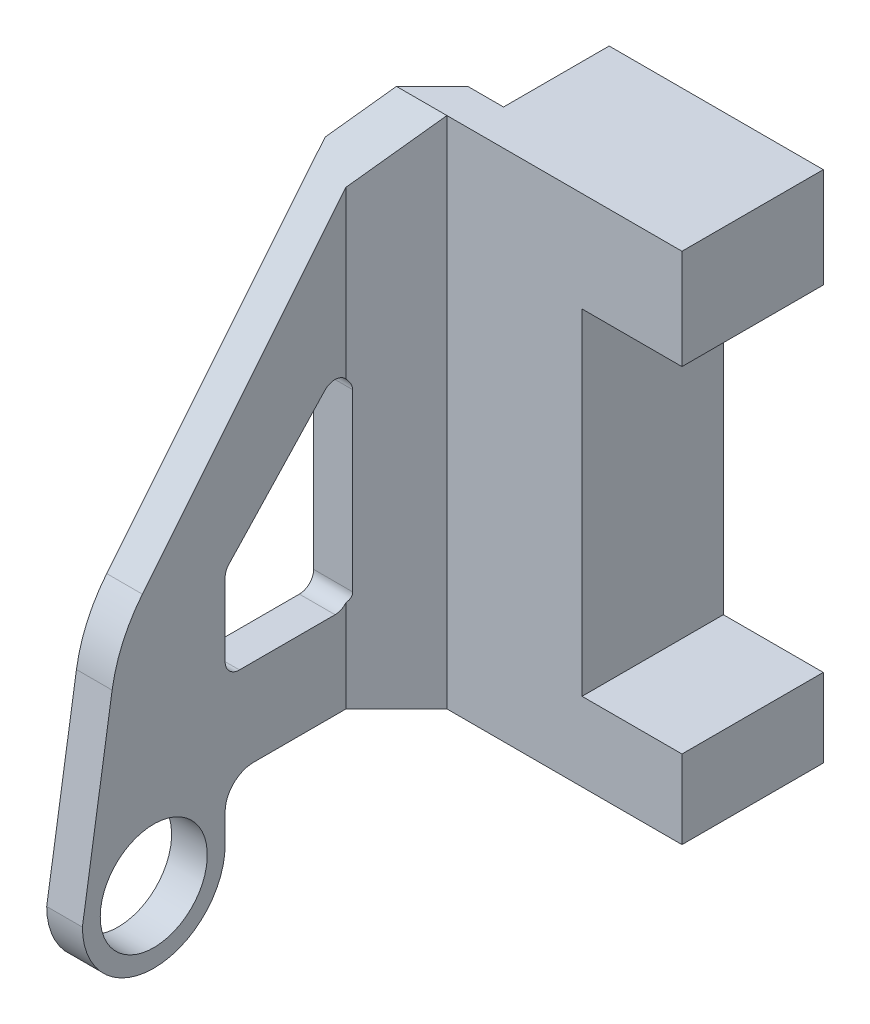
ISO-10303-21;
HEADER;
FILE_DESCRIPTION(('STEP AP214'),'2;1');
FILE_NAME('part.step','',(''),(''),'','','');
FILE_SCHEMA(('AUTOMOTIVE_DESIGN { 1 0 10303 214 1 1 1 1 }'));
ENDSEC;
DATA;
#1=APPLICATION_CONTEXT('core data for automotive mechanical design processes');
#2=APPLICATION_PROTOCOL_DEFINITION('international standard','automotive_design',2000,#1);
#3=PRODUCT_CONTEXT('',#1,'mechanical');
#4=PRODUCT('Part','Part','',(#3));
#5=PRODUCT_RELATED_PRODUCT_CATEGORY('part','',(#4));
#6=PRODUCT_DEFINITION_FORMATION('','',#4);
#7=PRODUCT_DEFINITION_CONTEXT('part definition',#1,'design');
#8=PRODUCT_DEFINITION('design','',#6,#7);
#9=PRODUCT_DEFINITION_SHAPE('','',#8);
#10=(LENGTH_UNIT() NAMED_UNIT(*) SI_UNIT(.MILLI.,.METRE.));
#11=(NAMED_UNIT(*) PLANE_ANGLE_UNIT() SI_UNIT($,.RADIAN.));
#12=(NAMED_UNIT(*) SI_UNIT($,.STERADIAN.) SOLID_ANGLE_UNIT());
#13=UNCERTAINTY_MEASURE_WITH_UNIT(LENGTH_MEASURE(1.E-05),#10,'distance_accuracy_value','');
#14=(GEOMETRIC_REPRESENTATION_CONTEXT(3) GLOBAL_UNCERTAINTY_ASSIGNED_CONTEXT((#13)) GLOBAL_UNIT_ASSIGNED_CONTEXT((#10,
#11,#12)) REPRESENTATION_CONTEXT('',''));
#15=CARTESIAN_POINT('',(0.,0.,0.));
#16=DIRECTION('',(0.,0.,1.));
#17=DIRECTION('',(1.,0.,0.));
#18=AXIS2_PLACEMENT_3D('',#15,#16,#17);
#19=CARTESIAN_POINT('',(-22.5,-4.,26.9));
#20=DIRECTION('',(-1.,0.,0.));
#21=DIRECTION('',(0.,0.,1.));
#22=AXIS2_PLACEMENT_3D('',#19,#20,#21);
#23=PLANE('',#22);
#24=CARTESIAN_POINT('',(-22.5,-4.,26.9));
#25=DIRECTION('',(-1.,0.,0.));
#26=DIRECTION('',(0.,0.,1.));
#27=AXIS2_PLACEMENT_3D('',#24,#25,#26);
#28=CIRCLE('',#27,3.75);
#29=CARTESIAN_POINT('',(-22.5,-4.,30.65));
#30=VERTEX_POINT('',#29);
#31=EDGE_CURVE('E776',#30,#30,#28,.T.);
#32=ORIENTED_EDGE('',*,*,#31,.F.);
#33=EDGE_LOOP('',(#32));
#34=FACE_BOUND('',#33,.T.);
#35=DIRECTION('',(0.,0.988012033751101,-0.15437688027361));
#36=VECTOR('',#35,1.);
#37=CARTESIAN_POINT('',(-22.5,-4.,31.9));
#38=LINE('',#37,#36);
#39=CARTESIAN_POINT('',(-22.5,-4.,31.9));
#40=VERTEX_POINT('',#39);
#41=CARTESIAN_POINT('',(-22.5,9.33291795760597,29.8167315691241));
#42=VERTEX_POINT('',#41);
#43=EDGE_CURVE('E312',#40,#42,#38,.T.);
#44=ORIENTED_EDGE('',*,*,#43,.T.);
#45=CARTESIAN_POINT('',(-22.5,7.78914915486987,19.9366112316131));
#46=DIRECTION('',(-1.,0.,0.));
#47=DIRECTION('',(0.,0.,1.));
#48=AXIS2_PLACEMENT_3D('',#45,#46,#47);
#49=CIRCLE('',#48,10.);
#50=CARTESIAN_POINT('',(-22.5,14.0950754058145,27.6977512327757));
#51=VERTEX_POINT('',#50);
#52=EDGE_CURVE('E367',#42,#51,#49,.T.);
#53=ORIENTED_EDGE('',*,*,#52,.T.);
#54=DIRECTION('',(0.,0.776114000116266,-0.630592625094466));
#55=VECTOR('',#54,1.);
#56=CARTESIAN_POINT('',(-22.5,12.,29.4));
#57=LINE('',#56,#55);
#58=CARTESIAN_POINT('',(-22.5,32.923076923077,12.4));
#59=VERTEX_POINT('',#58);
#60=EDGE_CURVE('E315',#51,#59,#57,.T.);
#61=ORIENTED_EDGE('',*,*,#60,.T.);
#62=DIRECTION('',(0.,1.,0.));
#63=VECTOR('',#62,1.);
#64=CARTESIAN_POINT('',(-22.5,-4.,12.4));
#65=LINE('',#64,#63);
#66=CARTESIAN_POINT('',(-22.5,0.,12.4));
#67=VERTEX_POINT('',#66);
#68=EDGE_CURVE('E299',#67,#59,#65,.T.);
#69=ORIENTED_EDGE('',*,*,#68,.F.);
#70=DIRECTION('',(0.,0.,1.));
#71=VECTOR('',#70,1.);
#72=CARTESIAN_POINT('',(-22.5,0.,7.4));
#73=LINE('',#72,#71);
#74=CARTESIAN_POINT('',(-22.5,0.,19.9));
#75=VERTEX_POINT('',#74);
#76=EDGE_CURVE('E306',#67,#75,#73,.T.);
#77=ORIENTED_EDGE('',*,*,#76,.T.);
#78=CARTESIAN_POINT('',(-22.5,-2.,19.9));
#79=DIRECTION('',(-1.,0.,0.));
#80=DIRECTION('',(0.,0.,1.));
#81=AXIS2_PLACEMENT_3D('',#78,#79,#80);
#82=CIRCLE('',#81,2.);
#83=CARTESIAN_POINT('',(-22.5,-2.,21.9));
#84=VERTEX_POINT('',#83);
#85=EDGE_CURVE('E11',#75,#84,#82,.F.);
#86=ORIENTED_EDGE('',*,*,#85,.T.);
#87=DIRECTION('',(0.,-1.,0.));
#88=VECTOR('',#87,1.);
#89=CARTESIAN_POINT('',(-22.5,0.,21.9));
#90=LINE('',#89,#88);
#91=CARTESIAN_POINT('',(-22.5,-4.,21.9));
#92=VERTEX_POINT('',#91);
#93=EDGE_CURVE('E308',#84,#92,#90,.T.);
#94=ORIENTED_EDGE('',*,*,#93,.T.);
#95=CARTESIAN_POINT('',(-22.5,-4.,26.9));
#96=DIRECTION('',(-1.,0.,0.));
#97=DIRECTION('',(0.,0.,1.));
#98=AXIS2_PLACEMENT_3D('',#95,#96,#97);
#99=CIRCLE('',#98,5.);
#100=EDGE_CURVE('E310',#92,#40,#99,.T.);
#101=ORIENTED_EDGE('',*,*,#100,.T.);
#102=EDGE_LOOP('',(#44,#53,#61,#69,#77,#86,#94,#101));
#103=FACE_BOUND('',#102,.T.);
#104=CARTESIAN_POINT('',(-22.5,19.3672423947041,14.2));
#105=DIRECTION('',(-1.,0.,0.));
#106=DIRECTION('',(0.,0.,1.));
#107=AXIS2_PLACEMENT_3D('',#104,#105,#106);
#108=CIRCLE('',#107,1.);
#109=CARTESIAN_POINT('',(-22.5,20.0503995234798,14.9302714135189));
#110=VERTEX_POINT('',#109);
#111=CARTESIAN_POINT('',(-22.5,19.3672423947041,13.2));
#112=VERTEX_POINT('',#111);
#113=EDGE_CURVE('E230',#110,#112,#108,.T.);
#114=ORIENTED_EDGE('',*,*,#113,.F.);
#115=DIRECTION('',(0.,-0.730271413518895,0.683157128775741));
#116=VECTOR('',#115,1.);
#117=CARTESIAN_POINT('',(-22.5,16.8061598224195,17.965205327414));
#118=LINE('',#117,#116);
#119=CARTESIAN_POINT('',(-22.5,12.8883305579626,21.6302714135189));
#120=VERTEX_POINT('',#119);
#121=EDGE_CURVE('E235',#110,#120,#118,.T.);
#122=ORIENTED_EDGE('',*,*,#121,.T.);
#123=CARTESIAN_POINT('',(-22.5,12.2051734291868,20.9));
#124=DIRECTION('',(-1.,0.,0.));
#125=DIRECTION('',(0.,0.,1.));
#126=AXIS2_PLACEMENT_3D('',#123,#124,#125);
#127=CIRCLE('',#126,1.);
#128=CARTESIAN_POINT('',(-22.5,12.2051734291868,21.9));
#129=VERTEX_POINT('',#128);
#130=EDGE_CURVE('E252',#129,#120,#127,.T.);
#131=ORIENTED_EDGE('',*,*,#130,.F.);
#132=DIRECTION('',(0.,-1.,0.));
#133=VECTOR('',#132,1.);
#134=CARTESIAN_POINT('',(-22.5,0.,21.9));
#135=LINE('',#134,#133);
#136=CARTESIAN_POINT('',(-22.5,7.09999999999999,21.9));
#137=VERTEX_POINT('',#136);
#138=EDGE_CURVE('E249',#129,#137,#135,.T.);
#139=ORIENTED_EDGE('',*,*,#138,.T.);
#140=CARTESIAN_POINT('',(-22.5,7.09999999999999,20.9));
#141=DIRECTION('',(-1.,0.,0.));
#142=DIRECTION('',(0.,0.,1.));
#143=AXIS2_PLACEMENT_3D('',#140,#141,#142);
#144=CIRCLE('',#143,1.);
#145=CARTESIAN_POINT('',(-22.5,6.09999999999999,20.9));
#146=VERTEX_POINT('',#145);
#147=EDGE_CURVE('E246',#146,#137,#144,.T.);
#148=ORIENTED_EDGE('',*,*,#147,.F.);
#149=DIRECTION('',(0.,0.,-1.));
#150=VECTOR('',#149,1.);
#151=CARTESIAN_POINT('',(-22.5,6.09999999999999,0.));
#152=LINE('',#151,#150);
#153=CARTESIAN_POINT('',(-22.5,6.09999999999999,14.2));
#154=VERTEX_POINT('',#153);
#155=EDGE_CURVE('E241',#146,#154,#152,.T.);
#156=ORIENTED_EDGE('',*,*,#155,.T.);
#157=CARTESIAN_POINT('',(-22.5,7.09999999999999,14.2));
#158=DIRECTION('',(-1.,0.,0.));
#159=DIRECTION('',(0.,0.,1.));
#160=AXIS2_PLACEMENT_3D('',#157,#158,#159);
#161=CIRCLE('',#160,1.);
#162=CARTESIAN_POINT('',(-22.5,7.09999999999999,13.2));
#163=VERTEX_POINT('',#162);
#164=EDGE_CURVE('E239',#163,#154,#161,.T.);
#165=ORIENTED_EDGE('',*,*,#164,.F.);
#166=DIRECTION('',(0.,1.,0.));
#167=VECTOR('',#166,1.);
#168=CARTESIAN_POINT('',(-22.5,0.,13.2));
#169=LINE('',#168,#167);
#170=EDGE_CURVE('E219',#163,#112,#169,.T.);
#171=ORIENTED_EDGE('',*,*,#170,.T.);
#172=EDGE_LOOP('',(#114,#122,#131,#139,#148,#156,#165,#171));
#173=FACE_BOUND('',#172,.T.);
#174=ADVANCED_FACE('F32',(#34,#103,#173),#23,.T.);
#175=CARTESIAN_POINT('',(-15.,36.,9.9));
#176=DIRECTION('',(1.,0.,0.));
#177=DIRECTION('',(0.,1.,0.));
#178=AXIS2_PLACEMENT_3D('',#175,#176,#177);
#179=PLANE('',#178);
#180=DIRECTION('',(0.,-1.,0.));
#181=VECTOR('',#180,1.);
#182=CARTESIAN_POINT('',(-15.,0.,7.4));
#183=LINE('',#182,#181);
#184=CARTESIAN_POINT('',(-15.,36.,7.4));
#185=VERTEX_POINT('',#184);
#186=CARTESIAN_POINT('',(-15.,0.,7.4));
#187=VERTEX_POINT('',#186);
#188=EDGE_CURVE('E305',#185,#187,#183,.T.);
#189=ORIENTED_EDGE('',*,*,#188,.F.);
#190=DIRECTION('',(0.,0.,-1.));
#191=VECTOR('',#190,1.);
#192=CARTESIAN_POINT('',(-15.,36.,9.9));
#193=LINE('',#192,#191);
#194=CARTESIAN_POINT('',(-15.,36.,0.));
#195=VERTEX_POINT('',#194);
#196=EDGE_CURVE('E445',#185,#195,#193,.T.);
#197=ORIENTED_EDGE('',*,*,#196,.T.);
#198=DIRECTION('',(0.,-1.,0.));
#199=VECTOR('',#198,1.);
#200=CARTESIAN_POINT('',(-15.,36.,0.));
#201=LINE('',#200,#199);
#202=CARTESIAN_POINT('',(-15.,0.,0.));
#203=VERTEX_POINT('',#202);
#204=EDGE_CURVE('E436',#195,#203,#201,.T.);
#205=ORIENTED_EDGE('',*,*,#204,.T.);
#206=DIRECTION('',(0.,0.,-1.));
#207=VECTOR('',#206,1.);
#208=CARTESIAN_POINT('',(-15.,0.,9.9));
#209=LINE('',#208,#207);
#210=EDGE_CURVE('E426',#187,#203,#209,.T.);
#211=ORIENTED_EDGE('',*,*,#210,.F.);
#212=EDGE_LOOP('',(#189,#197,#205,#211));
#213=FACE_BOUND('',#212,.T.);
#214=ADVANCED_FACE('F478',(#213),#179,.F.);
#215=CARTESIAN_POINT('',(0.,0.,9.9));
#216=DIRECTION('',(-1.,0.,0.));
#217=DIRECTION('',(0.,-1.,0.));
#218=AXIS2_PLACEMENT_3D('',#215,#216,#217);
#219=PLANE('',#218);
#220=DIRECTION('',(0.,1.,0.));
#221=VECTOR('',#220,1.);
#222=CARTESIAN_POINT('',(0.,0.,0.));
#223=LINE('',#222,#221);
#224=CARTESIAN_POINT('',(0.,0.,0.));
#225=VERTEX_POINT('',#224);
#226=CARTESIAN_POINT('',(0.,5.5,0.));
#227=VERTEX_POINT('',#226);
#228=EDGE_CURVE('E430',#225,#227,#223,.T.);
#229=ORIENTED_EDGE('',*,*,#228,.T.);
#230=DIRECTION('',(0.,0.,1.));
#231=VECTOR('',#230,1.);
#232=CARTESIAN_POINT('',(0.,5.5,0.));
#233=LINE('',#232,#231);
#234=CARTESIAN_POINT('',(0.,5.5,9.9));
#235=VERTEX_POINT('',#234);
#236=EDGE_CURVE('E410',#227,#235,#233,.T.);
#237=ORIENTED_EDGE('',*,*,#236,.T.);
#238=DIRECTION('',(0.,1.,0.));
#239=VECTOR('',#238,1.);
#240=CARTESIAN_POINT('',(0.,0.,9.9));
#241=LINE('',#240,#239);
#242=CARTESIAN_POINT('',(0.,0.,9.9));
#243=VERTEX_POINT('',#242);
#244=EDGE_CURVE('E420',#243,#235,#241,.T.);
#245=ORIENTED_EDGE('',*,*,#244,.F.);
#246=DIRECTION('',(0.,0.,-1.));
#247=VECTOR('',#246,1.);
#248=CARTESIAN_POINT('',(0.,0.,9.9));
#249=LINE('',#248,#247);
#250=EDGE_CURVE('E446',#243,#225,#249,.T.);
#251=ORIENTED_EDGE('',*,*,#250,.T.);
#252=EDGE_LOOP('',(#229,#237,#245,#251));
#253=FACE_BOUND('',#252,.T.);
#254=ADVANCED_FACE('F509',(#253),#219,.F.);
#255=CARTESIAN_POINT('',(-15.,0.,9.9));
#256=DIRECTION('',(0.,1.,0.));
#257=DIRECTION('',(0.,0.,1.));
#258=AXIS2_PLACEMENT_3D('',#255,#256,#257);
#259=PLANE('',#258);
#260=DIRECTION('',(0.,0.,1.));
#261=VECTOR('',#260,1.);
#262=CARTESIAN_POINT('',(-20.,0.,9.9));
#263=LINE('',#262,#261);
#264=CARTESIAN_POINT('',(-20.,0.,13.4355339059327));
#265=VERTEX_POINT('',#264);
#266=CARTESIAN_POINT('',(-20.,0.,19.9));
#267=VERTEX_POINT('',#266);
#268=EDGE_CURVE('E289',#265,#267,#263,.T.);
#269=ORIENTED_EDGE('',*,*,#268,.T.);
#270=DIRECTION('',(1.,0.,0.));
#271=VECTOR('',#270,1.);
#272=CARTESIAN_POINT('',(-22.5,0.,19.9));
#273=LINE('',#272,#271);
#274=EDGE_CURVE('E48',#267,#75,#273,.F.);
#275=ORIENTED_EDGE('',*,*,#274,.T.);
#276=ORIENTED_EDGE('',*,*,#76,.F.);
#277=DIRECTION('',(0.707106781186551,0.,-0.707106781186544));
#278=VECTOR('',#277,1.);
#279=CARTESIAN_POINT('',(-17.5,0.,7.39999999999999));
#280=LINE('',#279,#278);
#281=CARTESIAN_POINT('',(-17.5,0.,7.4));
#282=VERTEX_POINT('',#281);
#283=EDGE_CURVE('E302',#67,#282,#280,.T.);
#284=ORIENTED_EDGE('',*,*,#283,.T.);
#285=DIRECTION('',(1.,0.,0.));
#286=VECTOR('',#285,1.);
#287=CARTESIAN_POINT('',(-22.5,0.,7.4));
#288=LINE('',#287,#286);
#289=EDGE_CURVE('E335',#282,#187,#288,.T.);
#290=ORIENTED_EDGE('',*,*,#289,.T.);
#291=ORIENTED_EDGE('',*,*,#210,.T.);
#292=DIRECTION('',(1.,0.,0.));
#293=VECTOR('',#292,1.);
#294=CARTESIAN_POINT('',(-15.,0.,0.));
#295=LINE('',#294,#293);
#296=EDGE_CURVE('E413',#203,#225,#295,.T.);
#297=ORIENTED_EDGE('',*,*,#296,.T.);
#298=ORIENTED_EDGE('',*,*,#250,.F.);
#299=DIRECTION('',(1.,0.,0.));
#300=VECTOR('',#299,1.);
#301=CARTESIAN_POINT('',(-15.,0.,9.9));
#302=LINE('',#301,#300);
#303=CARTESIAN_POINT('',(-16.4644660940673,0.,9.9));
#304=VERTEX_POINT('',#303);
#305=EDGE_CURVE('E330',#304,#243,#302,.T.);
#306=ORIENTED_EDGE('',*,*,#305,.F.);
#307=DIRECTION('',(-0.707106781186551,0.,0.707106781186544));
#308=VECTOR('',#307,1.);
#309=CARTESIAN_POINT('',(-15.7322330470336,0.,9.16776695296637));
#310=LINE('',#309,#308);
#311=EDGE_CURVE('E291',#304,#265,#310,.T.);
#312=ORIENTED_EDGE('',*,*,#311,.T.);
#313=EDGE_LOOP('',(#269,#275,#276,#284,#290,#291,#297,#298,#306,#312));
#314=FACE_BOUND('',#313,.T.);
#315=ADVANCED_FACE('F481',(#314),#259,.F.);
#316=CARTESIAN_POINT('',(0.,29.,9.9));
#317=VERTEX_POINT('',#316);
#318=CARTESIAN_POINT('',(0.,36.,9.9));
#319=VERTEX_POINT('',#318);
#320=EDGE_CURVE('E424',#317,#319,#241,.T.);
#321=ORIENTED_EDGE('',*,*,#320,.F.);
#322=DIRECTION('',(0.,0.,1.));
#323=VECTOR('',#322,1.);
#324=CARTESIAN_POINT('',(0.,29.,0.));
#325=LINE('',#324,#323);
#326=CARTESIAN_POINT('',(0.,29.,0.));
#327=VERTEX_POINT('',#326);
#328=EDGE_CURVE('E404',#327,#317,#325,.T.);
#329=ORIENTED_EDGE('',*,*,#328,.F.);
#330=CARTESIAN_POINT('',(0.,36.,0.));
#331=VERTEX_POINT('',#330);
#332=EDGE_CURVE('E429',#327,#331,#223,.T.);
#333=ORIENTED_EDGE('',*,*,#332,.T.);
#334=DIRECTION('',(0.,0.,-1.));
#335=VECTOR('',#334,1.);
#336=CARTESIAN_POINT('',(0.,36.,9.9));
#337=LINE('',#336,#335);
#338=EDGE_CURVE('E447',#319,#331,#337,.T.);
#339=ORIENTED_EDGE('',*,*,#338,.F.);
#340=EDGE_LOOP('',(#321,#329,#333,#339));
#341=FACE_BOUND('',#340,.T.);
#342=ADVANCED_FACE('F504',(#341),#219,.F.);
#343=CARTESIAN_POINT('',(0.,36.,9.9));
#344=DIRECTION('',(0.,-1.,0.));
#345=DIRECTION('',(0.,0.,-1.));
#346=AXIS2_PLACEMENT_3D('',#343,#344,#345);
#347=PLANE('',#346);
#348=DIRECTION('',(1.,0.,0.));
#349=VECTOR('',#348,1.);
#350=CARTESIAN_POINT('',(-22.5,36.,7.4));
#351=LINE('',#350,#349);
#352=CARTESIAN_POINT('',(-17.5,36.,7.4));
#353=VERTEX_POINT('',#352);
#354=EDGE_CURVE('E317',#353,#185,#351,.T.);
#355=ORIENTED_EDGE('',*,*,#354,.F.);
#356=DIRECTION('',(0.707106781186551,0.,-0.707106781186544));
#357=VECTOR('',#356,1.);
#358=CARTESIAN_POINT('',(-17.5,36.,7.4));
#359=LINE('',#358,#357);
#360=CARTESIAN_POINT('',(-20.,36.,9.9));
#361=VERTEX_POINT('',#360);
#362=EDGE_CURVE('E294',#361,#353,#359,.T.);
#363=ORIENTED_EDGE('',*,*,#362,.F.);
#364=DIRECTION('',(1.,0.,0.));
#365=VECTOR('',#364,1.);
#366=CARTESIAN_POINT('',(-22.5,36.,9.9));
#367=LINE('',#366,#365);
#368=CARTESIAN_POINT('',(-16.4644660940673,36.,9.9));
#369=VERTEX_POINT('',#368);
#370=EDGE_CURVE('E320',#361,#369,#367,.T.);
#371=ORIENTED_EDGE('',*,*,#370,.T.);
#372=DIRECTION('',(-1.,0.,0.));
#373=VECTOR('',#372,1.);
#374=CARTESIAN_POINT('',(0.,36.,9.9));
#375=LINE('',#374,#373);
#376=EDGE_CURVE('E423',#319,#369,#375,.T.);
#377=ORIENTED_EDGE('',*,*,#376,.F.);
#378=ORIENTED_EDGE('',*,*,#338,.T.);
#379=DIRECTION('',(-1.,0.,0.));
#380=VECTOR('',#379,1.);
#381=CARTESIAN_POINT('',(0.,36.,0.));
#382=LINE('',#381,#380);
#383=EDGE_CURVE('E433',#331,#195,#382,.T.);
#384=ORIENTED_EDGE('',*,*,#383,.T.);
#385=ORIENTED_EDGE('',*,*,#196,.F.);
#386=EDGE_LOOP('',(#355,#363,#371,#377,#378,#384,#385));
#387=FACE_BOUND('',#386,.T.);
#388=ADVANCED_FACE('F473',(#387),#347,.F.);
#389=CARTESIAN_POINT('',(0.,0.,9.9));
#390=DIRECTION('',(0.,0.,1.));
#391=DIRECTION('',(1.,0.,0.));
#392=AXIS2_PLACEMENT_3D('',#389,#390,#391);
#393=PLANE('',#392);
#394=ORIENTED_EDGE('',*,*,#376,.T.);
#395=DIRECTION('',(0.,1.,0.));
#396=VECTOR('',#395,1.);
#397=CARTESIAN_POINT('',(-16.4644660940673,-101.5,9.9));
#398=LINE('',#397,#396);
#399=EDGE_CURVE('E272',#304,#369,#398,.T.);
#400=ORIENTED_EDGE('',*,*,#399,.F.);
#401=ORIENTED_EDGE('',*,*,#305,.T.);
#402=ORIENTED_EDGE('',*,*,#244,.T.);
#403=DIRECTION('',(1.,0.,0.));
#404=VECTOR('',#403,1.);
#405=CARTESIAN_POINT('',(-7.,5.5,9.9));
#406=LINE('',#405,#404);
#407=CARTESIAN_POINT('',(-7.,5.5,9.9));
#408=VERTEX_POINT('',#407);
#409=EDGE_CURVE('E398',#408,#235,#406,.T.);
#410=ORIENTED_EDGE('',*,*,#409,.F.);
#411=DIRECTION('',(0.,-1.,0.));
#412=VECTOR('',#411,1.);
#413=CARTESIAN_POINT('',(-7.,29.,9.9));
#414=LINE('',#413,#412);
#415=CARTESIAN_POINT('',(-7.,29.,9.9));
#416=VERTEX_POINT('',#415);
#417=EDGE_CURVE('E406',#416,#408,#414,.T.);
#418=ORIENTED_EDGE('',*,*,#417,.F.);
#419=DIRECTION('',(-1.,0.,0.));
#420=VECTOR('',#419,1.);
#421=CARTESIAN_POINT('',(0.,29.,9.9));
#422=LINE('',#421,#420);
#423=EDGE_CURVE('E392',#317,#416,#422,.T.);
#424=ORIENTED_EDGE('',*,*,#423,.F.);
#425=ORIENTED_EDGE('',*,*,#320,.T.);
#426=EDGE_LOOP('',(#394,#400,#401,#402,#410,#418,#424,#425));
#427=FACE_BOUND('',#426,.T.);
#428=ADVANCED_FACE('F498',(#427),#393,.T.);
#429=CARTESIAN_POINT('',(0.,0.,0.));
#430=DIRECTION('',(0.,0.,1.));
#431=DIRECTION('',(1.,0.,0.));
#432=AXIS2_PLACEMENT_3D('',#429,#430,#431);
#433=PLANE('',#432);
#434=DIRECTION('',(0.,-1.,0.));
#435=VECTOR('',#434,1.);
#436=CARTESIAN_POINT('',(-7.,29.,0.));
#437=LINE('',#436,#435);
#438=CARTESIAN_POINT('',(-7.,29.,0.));
#439=VERTEX_POINT('',#438);
#440=CARTESIAN_POINT('',(-7.,5.5,0.));
#441=VERTEX_POINT('',#440);
#442=EDGE_CURVE('E397',#439,#441,#437,.T.);
#443=ORIENTED_EDGE('',*,*,#442,.T.);
#444=DIRECTION('',(1.,0.,0.));
#445=VECTOR('',#444,1.);
#446=CARTESIAN_POINT('',(-7.,5.5,0.));
#447=LINE('',#446,#445);
#448=EDGE_CURVE('E401',#441,#227,#447,.T.);
#449=ORIENTED_EDGE('',*,*,#448,.T.);
#450=ORIENTED_EDGE('',*,*,#228,.F.);
#451=ORIENTED_EDGE('',*,*,#296,.F.);
#452=ORIENTED_EDGE('',*,*,#204,.F.);
#453=ORIENTED_EDGE('',*,*,#383,.F.);
#454=ORIENTED_EDGE('',*,*,#332,.F.);
#455=DIRECTION('',(-1.,0.,0.));
#456=VECTOR('',#455,1.);
#457=CARTESIAN_POINT('',(0.,29.,0.));
#458=LINE('',#457,#456);
#459=EDGE_CURVE('E394',#327,#439,#458,.T.);
#460=ORIENTED_EDGE('',*,*,#459,.T.);
#461=EDGE_LOOP('',(#443,#449,#450,#451,#452,#453,#454,#460));
#462=FACE_BOUND('',#461,.T.);
#463=ADVANCED_FACE('F507',(#462),#433,.F.);
#464=CARTESIAN_POINT('',(-7.,5.5,0.));
#465=DIRECTION('',(0.,-1.,0.));
#466=DIRECTION('',(0.,0.,-1.));
#467=AXIS2_PLACEMENT_3D('',#464,#465,#466);
#468=PLANE('',#467);
#469=ORIENTED_EDGE('',*,*,#409,.T.);
#470=ORIENTED_EDGE('',*,*,#236,.F.);
#471=ORIENTED_EDGE('',*,*,#448,.F.);
#472=DIRECTION('',(0.,0.,1.));
#473=VECTOR('',#472,1.);
#474=CARTESIAN_POINT('',(-7.,5.5,0.));
#475=LINE('',#474,#473);
#476=EDGE_CURVE('E414',#441,#408,#475,.T.);
#477=ORIENTED_EDGE('',*,*,#476,.T.);
#478=EDGE_LOOP('',(#469,#470,#471,#477));
#479=FACE_BOUND('',#478,.T.);
#480=ADVANCED_FACE('F512',(#479),#468,.F.);
#481=CARTESIAN_POINT('',(-7.,29.,0.));
#482=DIRECTION('',(-1.,0.,0.));
#483=DIRECTION('',(0.,-1.,0.));
#484=AXIS2_PLACEMENT_3D('',#481,#482,#483);
#485=PLANE('',#484);
#486=ORIENTED_EDGE('',*,*,#417,.T.);
#487=ORIENTED_EDGE('',*,*,#476,.F.);
#488=ORIENTED_EDGE('',*,*,#442,.F.);
#489=DIRECTION('',(0.,0.,1.));
#490=VECTOR('',#489,1.);
#491=CARTESIAN_POINT('',(-7.,29.,0.));
#492=LINE('',#491,#490);
#493=EDGE_CURVE('E416',#439,#416,#492,.T.);
#494=ORIENTED_EDGE('',*,*,#493,.T.);
#495=EDGE_LOOP('',(#486,#487,#488,#494));
#496=FACE_BOUND('',#495,.T.);
#497=ADVANCED_FACE('F514',(#496),#485,.F.);
#498=CARTESIAN_POINT('',(0.,29.,0.));
#499=DIRECTION('',(0.,1.,0.));
#500=DIRECTION('',(0.,0.,1.));
#501=AXIS2_PLACEMENT_3D('',#498,#499,#500);
#502=PLANE('',#501);
#503=ORIENTED_EDGE('',*,*,#423,.T.);
#504=ORIENTED_EDGE('',*,*,#493,.F.);
#505=ORIENTED_EDGE('',*,*,#459,.F.);
#506=ORIENTED_EDGE('',*,*,#328,.T.);
#507=EDGE_LOOP('',(#503,#504,#505,#506));
#508=FACE_BOUND('',#507,.T.);
#509=ADVANCED_FACE('F517',(#508),#502,.F.);
#510=CARTESIAN_POINT('',(-22.5,0.,7.4));
#511=DIRECTION('',(0.,0.,1.));
#512=DIRECTION('',(1.,0.,0.));
#513=AXIS2_PLACEMENT_3D('',#510,#511,#512);
#514=PLANE('',#513);
#515=ORIENTED_EDGE('',*,*,#289,.F.);
#516=DIRECTION('',(0.,1.,0.));
#517=VECTOR('',#516,1.);
#518=CARTESIAN_POINT('',(-17.5,-101.5,7.4));
#519=LINE('',#518,#517);
#520=EDGE_CURVE('E296',#282,#353,#519,.T.);
#521=ORIENTED_EDGE('',*,*,#520,.T.);
#522=ORIENTED_EDGE('',*,*,#354,.T.);
#523=ORIENTED_EDGE('',*,*,#188,.T.);
#524=EDGE_LOOP('',(#515,#521,#522,#523));
#525=FACE_BOUND('',#524,.T.);
#526=ADVANCED_FACE('F476',(#525),#514,.F.);
#527=CARTESIAN_POINT('',(-22.5,0.,21.9));
#528=DIRECTION('',(0.,0.,1.));
#529=DIRECTION('',(1.,0.,0.));
#530=AXIS2_PLACEMENT_3D('',#527,#528,#529);
#531=PLANE('',#530);
#532=ORIENTED_EDGE('',*,*,#93,.F.);
#533=DIRECTION('',(1.,0.,0.));
#534=VECTOR('',#533,1.);
#535=CARTESIAN_POINT('',(-20.,-2.,21.9));
#536=LINE('',#535,#534);
#537=CARTESIAN_POINT('',(-20.,-2.,21.9));
#538=VERTEX_POINT('',#537);
#539=EDGE_CURVE('E369',#84,#538,#536,.T.);
#540=ORIENTED_EDGE('',*,*,#539,.T.);
#541=DIRECTION('',(0.,-1.,0.));
#542=VECTOR('',#541,1.);
#543=CARTESIAN_POINT('',(-20.,0.,21.9));
#544=LINE('',#543,#542);
#545=CARTESIAN_POINT('',(-20.,-4.,21.9));
#546=VERTEX_POINT('',#545);
#547=EDGE_CURVE('E287',#538,#546,#544,.T.);
#548=ORIENTED_EDGE('',*,*,#547,.T.);
#549=DIRECTION('',(1.,0.,0.));
#550=VECTOR('',#549,1.);
#551=CARTESIAN_POINT('',(-22.5,-4.,21.9));
#552=LINE('',#551,#550);
#553=EDGE_CURVE('E388',#92,#546,#552,.T.);
#554=ORIENTED_EDGE('',*,*,#553,.F.);
#555=EDGE_LOOP('',(#532,#540,#548,#554));
#556=FACE_BOUND('',#555,.T.);
#557=ADVANCED_FACE('F376',(#556),#531,.F.);
#558=CARTESIAN_POINT('',(-22.5,-4.,26.9));
#559=DIRECTION('',(1.,0.,0.));
#560=DIRECTION('',(0.,0.,-1.));
#561=AXIS2_PLACEMENT_3D('',#558,#559,#560);
#562=CYLINDRICAL_SURFACE('',#561,5.);
#563=ORIENTED_EDGE('',*,*,#553,.T.);
#564=CARTESIAN_POINT('',(-20.,-4.,26.9));
#565=DIRECTION('',(-1.,0.,0.));
#566=DIRECTION('',(0.,0.,1.));
#567=AXIS2_PLACEMENT_3D('',#564,#565,#566);
#568=CIRCLE('',#567,5.);
#569=CARTESIAN_POINT('',(-20.,-4.,31.9));
#570=VERTEX_POINT('',#569);
#571=EDGE_CURVE('E284',#546,#570,#568,.T.);
#572=ORIENTED_EDGE('',*,*,#571,.T.);
#573=DIRECTION('',(1.,0.,0.));
#574=VECTOR('',#573,1.);
#575=CARTESIAN_POINT('',(-22.5,-4.,31.9));
#576=LINE('',#575,#574);
#577=EDGE_CURVE('E390',#40,#570,#576,.T.);
#578=ORIENTED_EDGE('',*,*,#577,.F.);
#579=ORIENTED_EDGE('',*,*,#100,.F.);
#580=EDGE_LOOP('',(#563,#572,#578,#579));
#581=FACE_BOUND('',#580,.T.);
#582=ADVANCED_FACE('F389',(#581),#562,.T.);
#583=CARTESIAN_POINT('',(-22.5,-4.,31.9));
#584=DIRECTION('',(0.,-0.15437688027361,-0.988012033751101));
#585=DIRECTION('',(0.,0.988012033751101,-0.15437688027361));
#586=AXIS2_PLACEMENT_3D('',#583,#584,#585);
#587=PLANE('',#586);
#588=DIRECTION('',(0.,0.988012033751101,-0.15437688027361));
#589=VECTOR('',#588,1.);
#590=CARTESIAN_POINT('',(-20.,-4.,31.9));
#591=LINE('',#590,#589);
#592=CARTESIAN_POINT('',(-20.,9.33291795760597,29.8167315691241));
#593=VERTEX_POINT('',#592);
#594=EDGE_CURVE('E281',#570,#593,#591,.T.);
#595=ORIENTED_EDGE('',*,*,#594,.T.);
#596=DIRECTION('',(1.,0.,0.));
#597=VECTOR('',#596,1.);
#598=CARTESIAN_POINT('',(-22.5,9.33291795760597,29.8167315691241));
#599=LINE('',#598,#597);
#600=EDGE_CURVE('E365',#593,#42,#599,.F.);
#601=ORIENTED_EDGE('',*,*,#600,.T.);
#602=ORIENTED_EDGE('',*,*,#43,.F.);
#603=ORIENTED_EDGE('',*,*,#577,.T.);
#604=EDGE_LOOP('',(#595,#601,#602,#603));
#605=FACE_BOUND('',#604,.T.);
#606=ADVANCED_FACE('F540',(#605),#587,.F.);
#607=CARTESIAN_POINT('',(-22.5,36.,9.9));
#608=DIRECTION('',(0.,-0.630592625094466,-0.776114000116265));
#609=DIRECTION('',(0.,0.776114000116266,-0.630592625094466));
#610=AXIS2_PLACEMENT_3D('',#607,#608,#609);
#611=PLANE('',#610);
#612=ORIENTED_EDGE('',*,*,#60,.F.);
#613=DIRECTION('',(1.,0.,0.));
#614=VECTOR('',#613,1.);
#615=CARTESIAN_POINT('',(-22.5,14.0950754058145,27.6977512327757));
#616=LINE('',#615,#614);
#617=CARTESIAN_POINT('',(-20.,14.0950754058145,27.6977512327757));
#618=VERTEX_POINT('',#617);
#619=EDGE_CURVE('E360',#51,#618,#616,.T.);
#620=ORIENTED_EDGE('',*,*,#619,.T.);
#621=DIRECTION('',(0.,0.776114000116266,-0.630592625094466));
#622=VECTOR('',#621,1.);
#623=CARTESIAN_POINT('',(-20.,36.,9.9));
#624=LINE('',#623,#622);
#625=CARTESIAN_POINT('',(-20.,31.6485736542367,13.4355339059327));
#626=VERTEX_POINT('',#625);
#627=EDGE_CURVE('E276',#618,#626,#624,.T.);
#628=ORIENTED_EDGE('',*,*,#627,.T.);
#629=DIRECTION('',(0.533396460910446,0.656487951889773,-0.53339646091044));
#630=VECTOR('',#629,1.);
#631=CARTESIAN_POINT('',(-18.1816466161256,33.8865470497744,11.6171805220583));
#632=LINE('',#631,#630);
#633=EDGE_CURVE('E337',#626,#369,#632,.T.);
#634=ORIENTED_EDGE('',*,*,#633,.T.);
#635=ORIENTED_EDGE('',*,*,#370,.F.);
#636=DIRECTION('',(-0.533396460910446,-0.656487951889772,0.53339646091044));
#637=VECTOR('',#636,1.);
#638=CARTESIAN_POINT('',(-20.7112794612795,35.1245791245791,10.6112794612795));
#639=LINE('',#638,#637);
#640=EDGE_CURVE('E341',#361,#59,#639,.T.);
#641=ORIENTED_EDGE('',*,*,#640,.T.);
#642=EDGE_LOOP('',(#612,#620,#628,#634,#635,#641));
#643=FACE_BOUND('',#642,.T.);
#644=ADVANCED_FACE('F465',(#643),#611,.F.);
#645=CARTESIAN_POINT('',(-17.5,-101.5,7.4));
#646=DIRECTION('',(0.707106781186544,0.,0.707106781186551));
#647=DIRECTION('',(0.707106781186551,0.,-0.707106781186544));
#648=AXIS2_PLACEMENT_3D('',#645,#646,#647);
#649=PLANE('',#648);
#650=ORIENTED_EDGE('',*,*,#68,.T.);
#651=ORIENTED_EDGE('',*,*,#640,.F.);
#652=ORIENTED_EDGE('',*,*,#362,.T.);
#653=ORIENTED_EDGE('',*,*,#520,.F.);
#654=ORIENTED_EDGE('',*,*,#283,.F.);
#655=EDGE_LOOP('',(#650,#651,#652,#653,#654));
#656=FACE_BOUND('',#655,.T.);
#657=ADVANCED_FACE('F470',(#656),#649,.F.);
#658=CARTESIAN_POINT('',(-16.4644660940673,-101.5,9.9));
#659=DIRECTION('',(-0.707106781186544,0.,-0.707106781186551));
#660=DIRECTION('',(-0.707106781186551,0.,0.707106781186544));
#661=AXIS2_PLACEMENT_3D('',#658,#659,#660);
#662=PLANE('',#661);
#663=DIRECTION('',(0.,1.,0.));
#664=VECTOR('',#663,1.);
#665=CARTESIAN_POINT('',(-19.7644660940673,-101.5,13.2));
#666=LINE('',#665,#664);
#667=CARTESIAN_POINT('',(-19.7644660940673,7.09999999999999,13.2));
#668=VERTEX_POINT('',#667);
#669=CARTESIAN_POINT('',(-19.7644660940673,19.3672423947041,13.2));
#670=VERTEX_POINT('',#669);
#671=EDGE_CURVE('E222',#668,#670,#666,.T.);
#672=ORIENTED_EDGE('',*,*,#671,.F.);
#673=CARTESIAN_POINT('',(-20.7644660940673,7.09999999999999,14.2));
#674=DIRECTION('',(-0.707106781186544,0.,-0.707106781186551));
#675=DIRECTION('',(-0.707106781186551,0.,0.707106781186544));
#676=AXIS2_PLACEMENT_3D('',#673,#674,#675);
#677=ELLIPSE('',#676,1.4142135623731,1.);
#678=CARTESIAN_POINT('',(-20.,6.45533606350169,13.4355339059327));
#679=VERTEX_POINT('',#678);
#680=EDGE_CURVE('E269',#668,#679,#677,.T.);
#681=ORIENTED_EDGE('',*,*,#680,.T.);
#682=DIRECTION('',(0.,1.,0.));
#683=VECTOR('',#682,1.);
#684=CARTESIAN_POINT('',(-20.,-101.5,13.4355339059327));
#685=LINE('',#684,#683);
#686=EDGE_CURVE('E273',#265,#679,#685,.T.);
#687=ORIENTED_EDGE('',*,*,#686,.F.);
#688=ORIENTED_EDGE('',*,*,#311,.F.);
#689=ORIENTED_EDGE('',*,*,#399,.T.);
#690=ORIENTED_EDGE('',*,*,#633,.F.);
#691=CARTESIAN_POINT('',(-20.,20.0119063312024,13.4355339059327));
#692=VERTEX_POINT('',#691);
#693=EDGE_CURVE('E277',#692,#626,#685,.T.);
#694=ORIENTED_EDGE('',*,*,#693,.F.);
#695=CARTESIAN_POINT('',(-20.7644660940673,19.3672423947041,14.2));
#696=DIRECTION('',(-0.707106781186544,0.,-0.707106781186551));
#697=DIRECTION('',(-0.707106781186551,0.,0.707106781186544));
#698=AXIS2_PLACEMENT_3D('',#695,#696,#697);
#699=ELLIPSE('',#698,1.4142135623731,1.);
#700=EDGE_CURVE('E257',#692,#670,#699,.T.);
#701=ORIENTED_EDGE('',*,*,#700,.T.);
#702=EDGE_LOOP('',(#672,#681,#687,#688,#689,#690,#694,#701));
#703=FACE_BOUND('',#702,.T.);
#704=ADVANCED_FACE('F493',(#703),#662,.F.);
#705=CARTESIAN_POINT('',(-20.,-101.5,13.4355339059327));
#706=DIRECTION('',(-1.,0.,0.));
#707=DIRECTION('',(0.,0.,1.));
#708=AXIS2_PLACEMENT_3D('',#705,#706,#707);
#709=PLANE('',#708);
#710=CARTESIAN_POINT('',(-20.,-4.,26.9));
#711=DIRECTION('',(-1.,0.,0.));
#712=DIRECTION('',(0.,0.,1.));
#713=AXIS2_PLACEMENT_3D('',#710,#711,#712);
#714=CIRCLE('',#713,3.75);
#715=CARTESIAN_POINT('',(-20.,-4.,30.65));
#716=VERTEX_POINT('',#715);
#717=EDGE_CURVE('E36',#716,#716,#714,.T.);
#718=ORIENTED_EDGE('',*,*,#717,.T.);
#719=EDGE_LOOP('',(#718));
#720=FACE_BOUND('',#719,.T.);
#721=ORIENTED_EDGE('',*,*,#627,.F.);
#722=CARTESIAN_POINT('',(-20.,7.78914915486987,19.9366112316131));
#723=DIRECTION('',(-1.,0.,0.));
#724=DIRECTION('',(0.,0.,1.));
#725=AXIS2_PLACEMENT_3D('',#722,#723,#724);
#726=CIRCLE('',#725,10.);
#727=EDGE_CURVE('E363',#618,#593,#726,.F.);
#728=ORIENTED_EDGE('',*,*,#727,.T.);
#729=ORIENTED_EDGE('',*,*,#594,.F.);
#730=ORIENTED_EDGE('',*,*,#571,.F.);
#731=ORIENTED_EDGE('',*,*,#547,.F.);
#732=CARTESIAN_POINT('',(-20.,-2.,19.9));
#733=DIRECTION('',(-1.,0.,0.));
#734=DIRECTION('',(0.,0.,1.));
#735=AXIS2_PLACEMENT_3D('',#732,#733,#734);
#736=CIRCLE('',#735,2.);
#737=EDGE_CURVE('E41',#538,#267,#736,.T.);
#738=ORIENTED_EDGE('',*,*,#737,.T.);
#739=ORIENTED_EDGE('',*,*,#268,.F.);
#740=ORIENTED_EDGE('',*,*,#686,.T.);
#741=CARTESIAN_POINT('',(-20.,7.09999999999999,14.2));
#742=DIRECTION('',(-1.,0.,0.));
#743=DIRECTION('',(0.,0.,1.));
#744=AXIS2_PLACEMENT_3D('',#741,#742,#743);
#745=CIRCLE('',#744,1.);
#746=CARTESIAN_POINT('',(-20.,6.09999999999999,14.2));
#747=VERTEX_POINT('',#746);
#748=EDGE_CURVE('E356',#679,#747,#745,.T.);
#749=ORIENTED_EDGE('',*,*,#748,.T.);
#750=DIRECTION('',(0.,0.,-1.));
#751=VECTOR('',#750,1.);
#752=CARTESIAN_POINT('',(-20.,6.09999999999999,13.4355339059327));
#753=LINE('',#752,#751);
#754=CARTESIAN_POINT('',(-20.,6.09999999999999,20.9));
#755=VERTEX_POINT('',#754);
#756=EDGE_CURVE('E354',#755,#747,#753,.T.);
#757=ORIENTED_EDGE('',*,*,#756,.F.);
#758=CARTESIAN_POINT('',(-20.,7.09999999999999,20.9));
#759=DIRECTION('',(-1.,0.,0.));
#760=DIRECTION('',(0.,0.,1.));
#761=AXIS2_PLACEMENT_3D('',#758,#759,#760);
#762=CIRCLE('',#761,1.);
#763=CARTESIAN_POINT('',(-20.,7.09999999999999,21.9));
#764=VERTEX_POINT('',#763);
#765=EDGE_CURVE('E351',#755,#764,#762,.T.);
#766=ORIENTED_EDGE('',*,*,#765,.T.);
#767=DIRECTION('',(0.,-1.,0.));
#768=VECTOR('',#767,1.);
#769=CARTESIAN_POINT('',(-20.,-101.5,21.9));
#770=LINE('',#769,#768);
#771=CARTESIAN_POINT('',(-20.,12.2051734291868,21.9));
#772=VERTEX_POINT('',#771);
#773=EDGE_CURVE('E349',#772,#764,#770,.T.);
#774=ORIENTED_EDGE('',*,*,#773,.F.);
#775=CARTESIAN_POINT('',(-20.,12.2051734291868,20.9));
#776=DIRECTION('',(-1.,0.,0.));
#777=DIRECTION('',(0.,0.,1.));
#778=AXIS2_PLACEMENT_3D('',#775,#776,#777);
#779=CIRCLE('',#778,1.);
#780=CARTESIAN_POINT('',(-20.,12.8883305579626,21.6302714135189));
#781=VERTEX_POINT('',#780);
#782=EDGE_CURVE('E346',#772,#781,#779,.T.);
#783=ORIENTED_EDGE('',*,*,#782,.T.);
#784=DIRECTION('',(0.,-0.730271413518895,0.683157128775741));
#785=VECTOR('',#784,1.);
#786=CARTESIAN_POINT('',(-20.,-44.0262735746024,74.8729656020474));
#787=LINE('',#786,#785);
#788=CARTESIAN_POINT('',(-20.,20.0503995234798,14.9302714135189));
#789=VERTEX_POINT('',#788);
#790=EDGE_CURVE('E344',#789,#781,#787,.T.);
#791=ORIENTED_EDGE('',*,*,#790,.F.);
#792=CARTESIAN_POINT('',(-20.,19.3672423947041,14.2));
#793=DIRECTION('',(-1.,0.,0.));
#794=DIRECTION('',(0.,0.,1.));
#795=AXIS2_PLACEMENT_3D('',#792,#793,#794);
#796=CIRCLE('',#795,1.);
#797=EDGE_CURVE('E340',#789,#692,#796,.T.);
#798=ORIENTED_EDGE('',*,*,#797,.T.);
#799=ORIENTED_EDGE('',*,*,#693,.T.);
#800=EDGE_LOOP('',(#721,#728,#729,#730,#731,#738,#739,#740,#749,#757,#766,#774,#783,#791,#798,#799));
#801=FACE_BOUND('',#800,.T.);
#802=ADVANCED_FACE('F382',(#720,#801),#709,.F.);
#803=CARTESIAN_POINT('',(115.,0.,13.2));
#804=DIRECTION('',(0.,0.,1.));
#805=DIRECTION('',(1.,0.,0.));
#806=AXIS2_PLACEMENT_3D('',#803,#804,#805);
#807=PLANE('',#806);
#808=ORIENTED_EDGE('',*,*,#671,.T.);
#809=DIRECTION('',(-1.,0.,0.));
#810=VECTOR('',#809,1.);
#811=CARTESIAN_POINT('',(115.,19.3672423947041,13.2));
#812=LINE('',#811,#810);
#813=EDGE_CURVE('E214',#670,#112,#812,.T.);
#814=ORIENTED_EDGE('',*,*,#813,.T.);
#815=ORIENTED_EDGE('',*,*,#170,.F.);
#816=DIRECTION('',(-1.,0.,0.));
#817=VECTOR('',#816,1.);
#818=CARTESIAN_POINT('',(115.,7.09999999999999,13.2));
#819=LINE('',#818,#817);
#820=EDGE_CURVE('E225',#668,#163,#819,.T.);
#821=ORIENTED_EDGE('',*,*,#820,.F.);
#822=EDGE_LOOP('',(#808,#814,#815,#821));
#823=FACE_BOUND('',#822,.T.);
#824=ADVANCED_FACE('F216',(#823),#807,.T.);
#825=CARTESIAN_POINT('',(115.,16.8061598224195,17.965205327414));
#826=DIRECTION('',(0.,-0.683157128775741,-0.730271413518895));
#827=DIRECTION('',(0.,0.730271413518895,-0.683157128775741));
#828=AXIS2_PLACEMENT_3D('',#825,#826,#827);
#829=PLANE('',#828);
#830=ORIENTED_EDGE('',*,*,#790,.T.);
#831=DIRECTION('',(-1.,0.,0.));
#832=VECTOR('',#831,1.);
#833=CARTESIAN_POINT('',(115.,12.8883305579626,21.6302714135189));
#834=LINE('',#833,#832);
#835=EDGE_CURVE('E255',#781,#120,#834,.T.);
#836=ORIENTED_EDGE('',*,*,#835,.T.);
#837=ORIENTED_EDGE('',*,*,#121,.F.);
#838=DIRECTION('',(-1.,0.,0.));
#839=VECTOR('',#838,1.);
#840=CARTESIAN_POINT('',(115.,20.0503995234798,14.9302714135189));
#841=LINE('',#840,#839);
#842=EDGE_CURVE('E226',#789,#110,#841,.T.);
#843=ORIENTED_EDGE('',*,*,#842,.F.);
#844=EDGE_LOOP('',(#830,#836,#837,#843));
#845=FACE_BOUND('',#844,.T.);
#846=ADVANCED_FACE('F578',(#845),#829,.T.);
#847=CARTESIAN_POINT('',(115.,12.2051734291868,20.9));
#848=DIRECTION('',(-1.,0.,0.));
#849=DIRECTION('',(0.,0.,1.));
#850=AXIS2_PLACEMENT_3D('',#847,#848,#849);
#851=CYLINDRICAL_SURFACE('',#850,1.);
#852=DIRECTION('',(-1.,0.,0.));
#853=VECTOR('',#852,1.);
#854=CARTESIAN_POINT('',(115.,12.2051734291868,21.9));
#855=LINE('',#854,#853);
#856=EDGE_CURVE('E258',#772,#129,#855,.T.);
#857=ORIENTED_EDGE('',*,*,#856,.T.);
#858=ORIENTED_EDGE('',*,*,#130,.T.);
#859=ORIENTED_EDGE('',*,*,#835,.F.);
#860=ORIENTED_EDGE('',*,*,#782,.F.);
#861=EDGE_LOOP('',(#857,#858,#859,#860));
#862=FACE_BOUND('',#861,.T.);
#863=ADVANCED_FACE('F581',(#862),#851,.F.);
#864=CARTESIAN_POINT('',(115.,0.,21.9));
#865=DIRECTION('',(0.,0.,-1.));
#866=DIRECTION('',(-1.,0.,0.));
#867=AXIS2_PLACEMENT_3D('',#864,#865,#866);
#868=PLANE('',#867);
#869=ORIENTED_EDGE('',*,*,#773,.T.);
#870=DIRECTION('',(-1.,0.,0.));
#871=VECTOR('',#870,1.);
#872=CARTESIAN_POINT('',(115.,7.09999999999999,21.9));
#873=LINE('',#872,#871);
#874=EDGE_CURVE('E260',#764,#137,#873,.T.);
#875=ORIENTED_EDGE('',*,*,#874,.T.);
#876=ORIENTED_EDGE('',*,*,#138,.F.);
#877=ORIENTED_EDGE('',*,*,#856,.F.);
#878=EDGE_LOOP('',(#869,#875,#876,#877));
#879=FACE_BOUND('',#878,.T.);
#880=ADVANCED_FACE('F724',(#879),#868,.T.);
#881=CARTESIAN_POINT('',(115.,7.09999999999999,20.9));
#882=DIRECTION('',(-1.,0.,0.));
#883=DIRECTION('',(0.,0.,1.));
#884=AXIS2_PLACEMENT_3D('',#881,#882,#883);
#885=CYLINDRICAL_SURFACE('',#884,1.);
#886=DIRECTION('',(-1.,0.,0.));
#887=VECTOR('',#886,1.);
#888=CARTESIAN_POINT('',(115.,6.09999999999999,20.9));
#889=LINE('',#888,#887);
#890=EDGE_CURVE('E262',#755,#146,#889,.T.);
#891=ORIENTED_EDGE('',*,*,#890,.T.);
#892=ORIENTED_EDGE('',*,*,#147,.T.);
#893=ORIENTED_EDGE('',*,*,#874,.F.);
#894=ORIENTED_EDGE('',*,*,#765,.F.);
#895=EDGE_LOOP('',(#891,#892,#893,#894));
#896=FACE_BOUND('',#895,.T.);
#897=ADVANCED_FACE('F733',(#896),#885,.F.);
#898=CARTESIAN_POINT('',(115.,6.09999999999999,0.));
#899=DIRECTION('',(0.,1.,0.));
#900=DIRECTION('',(0.,0.,1.));
#901=AXIS2_PLACEMENT_3D('',#898,#899,#900);
#902=PLANE('',#901);
#903=ORIENTED_EDGE('',*,*,#756,.T.);
#904=DIRECTION('',(-1.,0.,0.));
#905=VECTOR('',#904,1.);
#906=CARTESIAN_POINT('',(115.,6.09999999999999,14.2));
#907=LINE('',#906,#905);
#908=EDGE_CURVE('E264',#747,#154,#907,.T.);
#909=ORIENTED_EDGE('',*,*,#908,.T.);
#910=ORIENTED_EDGE('',*,*,#155,.F.);
#911=ORIENTED_EDGE('',*,*,#890,.F.);
#912=EDGE_LOOP('',(#903,#909,#910,#911));
#913=FACE_BOUND('',#912,.T.);
#914=ADVANCED_FACE('F573',(#913),#902,.T.);
#915=CARTESIAN_POINT('',(115.,7.09999999999999,14.2));
#916=DIRECTION('',(-1.,0.,0.));
#917=DIRECTION('',(0.,0.,1.));
#918=AXIS2_PLACEMENT_3D('',#915,#916,#917);
#919=CYLINDRICAL_SURFACE('',#918,1.);
#920=ORIENTED_EDGE('',*,*,#820,.T.);
#921=ORIENTED_EDGE('',*,*,#164,.T.);
#922=ORIENTED_EDGE('',*,*,#908,.F.);
#923=ORIENTED_EDGE('',*,*,#748,.F.);
#924=ORIENTED_EDGE('',*,*,#680,.F.);
#925=EDGE_LOOP('',(#920,#921,#922,#923,#924));
#926=FACE_BOUND('',#925,.T.);
#927=ADVANCED_FACE('F568',(#926),#919,.F.);
#928=CARTESIAN_POINT('',(115.,19.3672423947041,14.2));
#929=DIRECTION('',(-1.,0.,0.));
#930=DIRECTION('',(0.,0.,1.));
#931=AXIS2_PLACEMENT_3D('',#928,#929,#930);
#932=CYLINDRICAL_SURFACE('',#931,1.);
#933=ORIENTED_EDGE('',*,*,#797,.F.);
#934=ORIENTED_EDGE('',*,*,#842,.T.);
#935=ORIENTED_EDGE('',*,*,#113,.T.);
#936=ORIENTED_EDGE('',*,*,#813,.F.);
#937=ORIENTED_EDGE('',*,*,#700,.F.);
#938=EDGE_LOOP('',(#933,#934,#935,#936,#937));
#939=FACE_BOUND('',#938,.T.);
#940=ADVANCED_FACE('F231',(#939),#932,.F.);
#941=CARTESIAN_POINT('',(-22.5,7.78914915486987,19.9366112316131));
#942=DIRECTION('',(1.,0.,0.));
#943=DIRECTION('',(0.,0.,-1.));
#944=AXIS2_PLACEMENT_3D('',#941,#942,#943);
#945=CYLINDRICAL_SURFACE('',#944,10.);
#946=ORIENTED_EDGE('',*,*,#52,.F.);
#947=ORIENTED_EDGE('',*,*,#600,.F.);
#948=ORIENTED_EDGE('',*,*,#727,.F.);
#949=ORIENTED_EDGE('',*,*,#619,.F.);
#950=EDGE_LOOP('',(#946,#947,#948,#949));
#951=FACE_BOUND('',#950,.T.);
#952=ADVANCED_FACE('F487',(#951),#945,.T.);
#953=CARTESIAN_POINT('',(-22.5,-2.,19.9));
#954=DIRECTION('',(-1.,0.,0.));
#955=DIRECTION('',(0.,0.,1.));
#956=AXIS2_PLACEMENT_3D('',#953,#954,#955);
#957=CYLINDRICAL_SURFACE('',#956,2.);
#958=ORIENTED_EDGE('',*,*,#85,.F.);
#959=ORIENTED_EDGE('',*,*,#274,.F.);
#960=ORIENTED_EDGE('',*,*,#737,.F.);
#961=ORIENTED_EDGE('',*,*,#539,.F.);
#962=EDGE_LOOP('',(#958,#959,#960,#961));
#963=FACE_BOUND('',#962,.T.);
#964=ADVANCED_FACE('F34',(#963),#957,.F.);
#965=CARTESIAN_POINT('',(-12.5,-4.,26.9));
#966=DIRECTION('',(-1.,0.,0.));
#967=DIRECTION('',(0.,0.,1.));
#968=AXIS2_PLACEMENT_3D('',#965,#966,#967);
#969=CYLINDRICAL_SURFACE('',#968,3.75);
#970=ORIENTED_EDGE('',*,*,#31,.T.);
#971=EDGE_LOOP('',(#970));
#972=FACE_BOUND('',#971,.T.);
#973=ORIENTED_EDGE('',*,*,#717,.F.);
#974=EDGE_LOOP('',(#973));
#975=FACE_BOUND('',#974,.T.);
#976=ADVANCED_FACE('F567',(#972,#975),#969,.F.);
#977=CLOSED_SHELL('',(#174,#214,#254,#315,#342,#388,#428,#463,#480,#497,#509,#526,#557,#582,
#606,#644,#657,#704,#802,#824,#846,#863,#880,#897,#914,#927,#940,#952,#964,#976));
#978=MANIFOLD_SOLID_BREP('B2',#977);
#979=ADVANCED_BREP_SHAPE_REPRESENTATION('',(#18,#978),#14);
#980=SHAPE_DEFINITION_REPRESENTATION(#9,#979);
ENDSEC;
END-ISO-10303-21;
